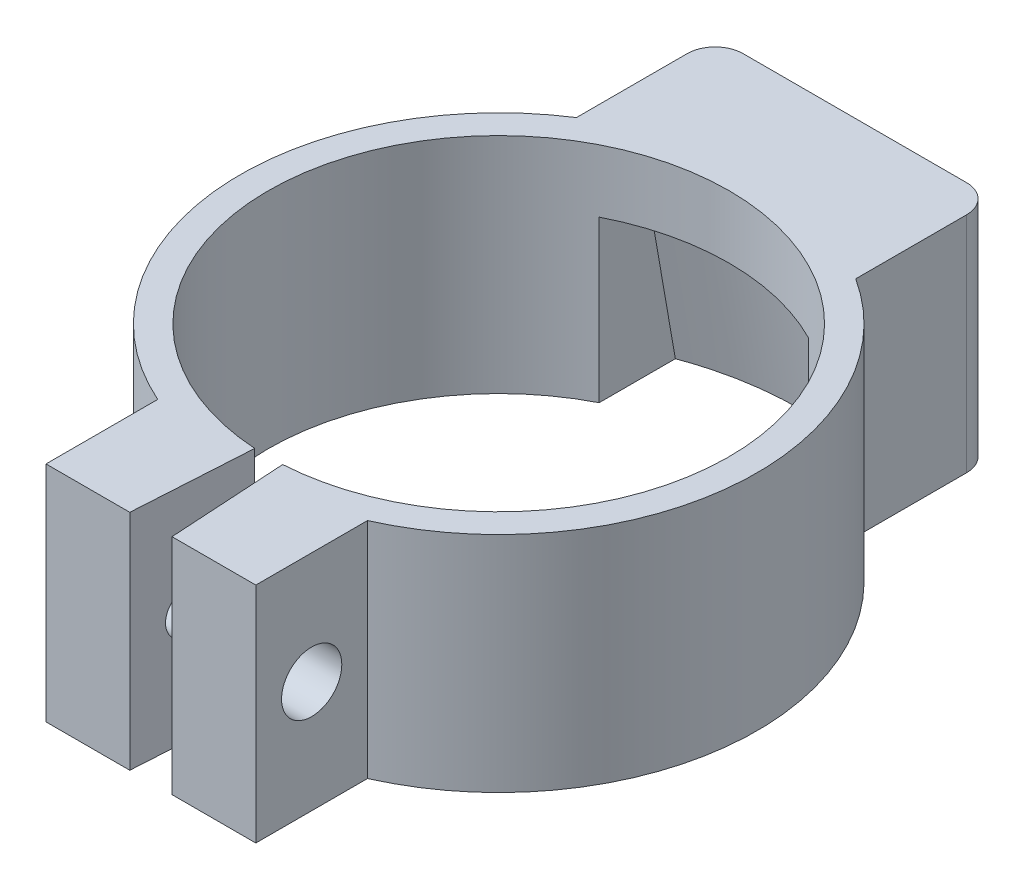
ISO-10303-21;
HEADER;
FILE_DESCRIPTION(('STEP AP214'),'2;1');
FILE_NAME('part.step','',(''),(''),'','','');
FILE_SCHEMA(('AUTOMOTIVE_DESIGN { 1 0 10303 214 1 1 1 1 }'));
ENDSEC;
DATA;
#1=APPLICATION_CONTEXT('core data for automotive mechanical design processes');
#2=APPLICATION_PROTOCOL_DEFINITION('international standard','automotive_design',2000,#1);
#3=PRODUCT_CONTEXT('',#1,'mechanical');
#4=PRODUCT('Part','Part','',(#3));
#5=PRODUCT_RELATED_PRODUCT_CATEGORY('part','',(#4));
#6=PRODUCT_DEFINITION_FORMATION('','',#4);
#7=PRODUCT_DEFINITION_CONTEXT('part definition',#1,'design');
#8=PRODUCT_DEFINITION('design','',#6,#7);
#9=PRODUCT_DEFINITION_SHAPE('','',#8);
#10=(LENGTH_UNIT() NAMED_UNIT(*) SI_UNIT(.MILLI.,.METRE.));
#11=(NAMED_UNIT(*) PLANE_ANGLE_UNIT() SI_UNIT($,.RADIAN.));
#12=(NAMED_UNIT(*) SI_UNIT($,.STERADIAN.) SOLID_ANGLE_UNIT());
#13=UNCERTAINTY_MEASURE_WITH_UNIT(LENGTH_MEASURE(1.E-05),#10,'distance_accuracy_value','');
#14=(GEOMETRIC_REPRESENTATION_CONTEXT(3) GLOBAL_UNCERTAINTY_ASSIGNED_CONTEXT((#13)) GLOBAL_UNIT_ASSIGNED_CONTEXT((#10,
#11,#12)) REPRESENTATION_CONTEXT('',''));
#15=CARTESIAN_POINT('',(0.,0.,0.));
#16=DIRECTION('',(0.,0.,1.));
#17=DIRECTION('',(1.,0.,0.));
#18=AXIS2_PLACEMENT_3D('',#15,#16,#17);
#19=CARTESIAN_POINT('',(0.,16.,0.));
#20=DIRECTION('',(0.,-1.,0.));
#21=DIRECTION('',(0.,0.,-1.));
#22=AXIS2_PLACEMENT_3D('',#19,#20,#21);
#23=CYLINDRICAL_SURFACE('',#22,16.5);
#24=DIRECTION('',(0.,-1.,0.));
#25=VECTOR('',#24,1.);
#26=CARTESIAN_POINT('',(7.5,16.,-14.6969384566991));
#27=LINE('',#26,#25);
#28=CARTESIAN_POINT('',(7.5,0.,-14.6969384566991));
#29=VERTEX_POINT('',#28);
#30=CARTESIAN_POINT('',(7.5,11.5102545806533,-14.6969384566991));
#31=VERTEX_POINT('',#30);
#32=EDGE_CURVE('E167',#29,#31,#27,.F.);
#33=ORIENTED_EDGE('',*,*,#32,.F.);
#34=CARTESIAN_POINT('',(0.,0.,0.));
#35=DIRECTION('',(0.,-1.,0.));
#36=DIRECTION('',(0.,0.,1.));
#37=AXIS2_PLACEMENT_3D('',#34,#35,#36);
#38=CIRCLE('',#37,16.5);
#39=CARTESIAN_POINT('',(1.,0.,16.4696690920006));
#40=VERTEX_POINT('',#39);
#41=EDGE_CURVE('E196',#29,#40,#38,.T.);
#42=ORIENTED_EDGE('',*,*,#41,.T.);
#43=DIRECTION('',(0.,-1.,0.));
#44=VECTOR('',#43,1.);
#45=CARTESIAN_POINT('',(1.,16.,16.4696690920006));
#46=LINE('',#45,#44);
#47=CARTESIAN_POINT('',(1.,16.,16.4696690920006));
#48=VERTEX_POINT('',#47);
#49=EDGE_CURVE('E191',#48,#40,#46,.T.);
#50=ORIENTED_EDGE('',*,*,#49,.F.);
#51=CARTESIAN_POINT('',(0.,16.,0.));
#52=DIRECTION('',(0.,-1.,0.));
#53=DIRECTION('',(0.,0.,1.));
#54=AXIS2_PLACEMENT_3D('',#51,#52,#53);
#55=CIRCLE('',#54,16.5);
#56=CARTESIAN_POINT('',(-0.999999999999988,16.,16.4696690920006));
#57=VERTEX_POINT('',#56);
#58=EDGE_CURVE('E197',#57,#48,#55,.T.);
#59=ORIENTED_EDGE('',*,*,#58,.F.);
#60=DIRECTION('',(0.,-1.,0.));
#61=VECTOR('',#60,1.);
#62=CARTESIAN_POINT('',(-0.999999999999988,16.,16.4696690920006));
#63=LINE('',#62,#61);
#64=CARTESIAN_POINT('',(-0.999999999999988,0.,16.4696690920006));
#65=VERTEX_POINT('',#64);
#66=EDGE_CURVE('E223',#57,#65,#63,.T.);
#67=ORIENTED_EDGE('',*,*,#66,.T.);
#68=CARTESIAN_POINT('',(-7.5,0.,-14.6969384566991));
#69=VERTEX_POINT('',#68);
#70=EDGE_CURVE('E224',#65,#69,#38,.T.);
#71=ORIENTED_EDGE('',*,*,#70,.T.);
#72=DIRECTION('',(0.,-1.,0.));
#73=VECTOR('',#72,1.);
#74=CARTESIAN_POINT('',(-7.5,16.,-14.6969384566991));
#75=LINE('',#74,#73);
#76=CARTESIAN_POINT('',(-7.5,11.5102545806533,-14.6969384566991));
#77=VERTEX_POINT('',#76);
#78=EDGE_CURVE('E192',#77,#69,#75,.T.);
#79=ORIENTED_EDGE('',*,*,#78,.F.);
#80=CARTESIAN_POINT('',(0.,11.5102545806533,0.));
#81=DIRECTION('',(0.,1.,0.));
#82=DIRECTION('',(0.,0.,1.));
#83=AXIS2_PLACEMENT_3D('',#80,#81,#82);
#84=CIRCLE('',#83,16.5);
#85=EDGE_CURVE('E190',#77,#31,#84,.F.);
#86=ORIENTED_EDGE('',*,*,#85,.T.);
#87=EDGE_LOOP('',(#33,#42,#50,#59,#67,#71,#79,#86));
#88=FACE_BOUND('',#87,.T.);
#89=ADVANCED_FACE('F33',(#88),#23,.F.);
#90=CARTESIAN_POINT('',(0.,0.,0.));
#91=DIRECTION('',(0.,1.,0.));
#92=DIRECTION('',(0.,0.,1.));
#93=AXIS2_PLACEMENT_3D('',#90,#91,#92);
#94=PLANE('',#93);
#95=DIRECTION('',(0.,0.,1.));
#96=VECTOR('',#95,1.);
#97=CARTESIAN_POINT('',(-10.,0.,-25.5));
#98=LINE('',#97,#96);
#99=CARTESIAN_POINT('',(-10.,0.,-23.5));
#100=VERTEX_POINT('',#99);
#101=CARTESIAN_POINT('',(-10.,0.,-15.5643824162734));
#102=VERTEX_POINT('',#101);
#103=EDGE_CURVE('E239',#100,#102,#98,.T.);
#104=ORIENTED_EDGE('',*,*,#103,.F.);
#105=CARTESIAN_POINT('',(-8.00000000000002,0.,-23.5));
#106=DIRECTION('',(0.,1.,0.));
#107=DIRECTION('',(0.,0.,1.));
#108=AXIS2_PLACEMENT_3D('',#105,#106,#107);
#109=CIRCLE('',#108,2.);
#110=CARTESIAN_POINT('',(-8.00000000000002,0.,-25.5));
#111=VERTEX_POINT('',#110);
#112=EDGE_CURVE('E282',#100,#111,#109,.F.);
#113=ORIENTED_EDGE('',*,*,#112,.T.);
#114=DIRECTION('',(-1.,0.,0.));
#115=VECTOR('',#114,1.);
#116=CARTESIAN_POINT('',(-10.,0.,-25.5));
#117=LINE('',#116,#115);
#118=CARTESIAN_POINT('',(8.,0.,-25.5));
#119=VERTEX_POINT('',#118);
#120=EDGE_CURVE('E237',#119,#111,#117,.T.);
#121=ORIENTED_EDGE('',*,*,#120,.F.);
#122=CARTESIAN_POINT('',(8.,0.,-23.5));
#123=DIRECTION('',(0.,1.,0.));
#124=DIRECTION('',(0.,0.,1.));
#125=AXIS2_PLACEMENT_3D('',#122,#123,#124);
#126=CIRCLE('',#125,2.);
#127=CARTESIAN_POINT('',(10.,0.,-23.5));
#128=VERTEX_POINT('',#127);
#129=EDGE_CURVE('E280',#119,#128,#126,.F.);
#130=ORIENTED_EDGE('',*,*,#129,.T.);
#131=DIRECTION('',(0.,0.,-1.));
#132=VECTOR('',#131,1.);
#133=CARTESIAN_POINT('',(10.,0.,-25.5));
#134=LINE('',#133,#132);
#135=CARTESIAN_POINT('',(10.,0.,-15.5643824162734));
#136=VERTEX_POINT('',#135);
#137=EDGE_CURVE('E235',#136,#128,#134,.T.);
#138=ORIENTED_EDGE('',*,*,#137,.F.);
#139=CARTESIAN_POINT('',(0.,0.,0.));
#140=DIRECTION('',(0.,1.,0.));
#141=DIRECTION('',(0.,0.,1.));
#142=AXIS2_PLACEMENT_3D('',#139,#140,#141);
#143=CIRCLE('',#142,18.5);
#144=CARTESIAN_POINT('',(7.51224050771347,0.,16.9061007495599));
#145=VERTEX_POINT('',#144);
#146=EDGE_CURVE('E233',#145,#136,#143,.T.);
#147=ORIENTED_EDGE('',*,*,#146,.F.);
#148=DIRECTION('',(0.,0.,-1.));
#149=VECTOR('',#148,1.);
#150=CARTESIAN_POINT('',(7.51224050771347,0.,24.9061007495599));
#151=LINE('',#150,#149);
#152=CARTESIAN_POINT('',(7.51224050771347,0.,24.9061007495599));
#153=VERTEX_POINT('',#152);
#154=EDGE_CURVE('E231',#153,#145,#151,.T.);
#155=ORIENTED_EDGE('',*,*,#154,.F.);
#156=DIRECTION('',(1.,0.,0.));
#157=VECTOR('',#156,1.);
#158=CARTESIAN_POINT('',(1.51224050771347,0.,24.9061007495599));
#159=LINE('',#158,#157);
#160=CARTESIAN_POINT('',(1.51224050771347,0.,24.9061007495599));
#161=VERTEX_POINT('',#160);
#162=EDGE_CURVE('E229',#161,#153,#159,.T.);
#163=ORIENTED_EDGE('',*,*,#162,.F.);
#164=DIRECTION('',(0.0606060606060607,0.,0.998161763151552));
#165=VECTOR('',#164,1.);
#166=CARTESIAN_POINT('',(1.,0.,16.4696690920006));
#167=LINE('',#166,#165);
#168=EDGE_CURVE('E227',#40,#161,#167,.T.);
#169=ORIENTED_EDGE('',*,*,#168,.F.);
#170=ORIENTED_EDGE('',*,*,#41,.F.);
#171=DIRECTION('',(0.,0.,-1.));
#172=VECTOR('',#171,1.);
#173=CARTESIAN_POINT('',(7.5,0.,-18.1494416796099));
#174=LINE('',#173,#172);
#175=CARTESIAN_POINT('',(7.5,0.,-20.1494416796099));
#176=VERTEX_POINT('',#175);
#177=EDGE_CURVE('E188',#29,#176,#174,.T.);
#178=ORIENTED_EDGE('',*,*,#177,.T.);
#179=CARTESIAN_POINT('',(7.5,0.,-20.1494416796099));
#180=CARTESIAN_POINT('',(7.16475403210479,0.,-20.2742349802381));
#181=CARTESIAN_POINT('',(6.82638911447382,0.,-20.390646524342));
#182=CARTESIAN_POINT('',(6.14429831053419,0.,-20.6064420032133));
#183=CARTESIAN_POINT('',(5.80057280054934,0.,-20.7058271274494));
#184=CARTESIAN_POINT('',(5.10860092589791,0.,-20.8873204885351));
#185=CARTESIAN_POINT('',(4.76035469587702,0.,-20.9694292386987));
#186=CARTESIAN_POINT('',(4.05949924995959,0.,-21.1163186682423));
#187=CARTESIAN_POINT('',(3.70688268749984,0.,-21.18106428229));
#188=CARTESIAN_POINT('',(2.99884233367474,0.,-21.2928483222732));
#189=CARTESIAN_POINT('',(2.64341849642989,0.,-21.3398864582002));
#190=CARTESIAN_POINT('',(1.93067071288312,0.,-21.4161389406646));
#191=CARTESIAN_POINT('',(1.57334668941058,0.,-21.4453525576471));
#192=CARTESIAN_POINT('',(0.611433592468125,0.,-21.4998149719763));
#193=CARTESIAN_POINT('',(0.00583316623607212,0.,-21.5085133370044));
#194=CARTESIAN_POINT('',(-1.20404534343382,0.,-21.4747890906468));
#195=CARTESIAN_POINT('',(-1.80832321021341,0.,-21.4323586520107));
#196=CARTESIAN_POINT('',(-2.70973722956552,0.,-21.3306962680113));
#197=CARTESIAN_POINT('',(-3.00912394907806,0.,-21.290522630107));
#198=CARTESIAN_POINT('',(-3.60585369761852,0.,-21.1976177237416));
#199=CARTESIAN_POINT('',(-3.90319723427066,0.,-21.1448896996906));
#200=CARTESIAN_POINT('',(-4.79125375433414,0.,-20.9680205933349));
#201=CARTESIAN_POINT('',(-5.37839675731777,0.,-20.8251488548804));
#202=CARTESIAN_POINT('',(-6.21849099831456,0.,-20.5828527744341));
#203=CARTESIAN_POINT('',(-6.47723965517101,0.,-20.5028959028532));
#204=CARTESIAN_POINT('',(-6.9912359309097,0.,-20.3333645235655));
#205=CARTESIAN_POINT('',(-7.2464872441091,0.,-20.2438012166994));
#206=CARTESIAN_POINT('',(-7.5,0.,-20.1494416796099));
#207=B_SPLINE_CURVE_WITH_KNOTS('',3,(#179,#180,#181,#182,#183,#184,#185,#186,#187,#188,#189,
#190,#191,#192,#193,#194,#195,#196,#197,#198,#199,#200,#201,#202,#203,#204,#205,#206),
.UNSPECIFIED.,.F.,.F.,(4,2,2,2,2,2,2,2,2,2,2,2,2,4),(0.,1.07304557880704,2.14601616386372,
3.21895486441766,4.29404434958836,5.36915144153298,6.44430253450244,8.25902479211883,
10.0740248988004,10.9799954654977,11.8857321573009,13.695989208273,14.5083027837762,
15.319679313318),.UNSPECIFIED.);
#208=CARTESIAN_POINT('',(-7.5,0.,-20.1494416796099));
#209=VERTEX_POINT('',#208);
#210=EDGE_CURVE('E182',#176,#209,#207,.T.);
#211=ORIENTED_EDGE('',*,*,#210,.T.);
#212=DIRECTION('',(0.,0.,1.));
#213=VECTOR('',#212,1.);
#214=CARTESIAN_POINT('',(-7.5,0.,-18.1494416796099));
#215=LINE('',#214,#213);
#216=EDGE_CURVE('E194',#209,#69,#215,.T.);
#217=ORIENTED_EDGE('',*,*,#216,.T.);
#218=ORIENTED_EDGE('',*,*,#70,.F.);
#219=DIRECTION('',(0.0606060606060612,0.,-0.998161763151552));
#220=VECTOR('',#219,1.);
#221=CARTESIAN_POINT('',(-0.999999999999988,0.,16.4696690920006));
#222=LINE('',#221,#220);
#223=CARTESIAN_POINT('',(-1.51224050771347,0.,24.9061007495599));
#224=VERTEX_POINT('',#223);
#225=EDGE_CURVE('E201',#224,#65,#222,.T.);
#226=ORIENTED_EDGE('',*,*,#225,.F.);
#227=DIRECTION('',(1.,0.,0.));
#228=VECTOR('',#227,1.);
#229=CARTESIAN_POINT('',(-1.51224050771347,0.,24.9061007495599));
#230=LINE('',#229,#228);
#231=CARTESIAN_POINT('',(-7.51224050771347,0.,24.9061007495599));
#232=VERTEX_POINT('',#231);
#233=EDGE_CURVE('E245',#232,#224,#230,.T.);
#234=ORIENTED_EDGE('',*,*,#233,.F.);
#235=DIRECTION('',(0.,0.,1.));
#236=VECTOR('',#235,1.);
#237=CARTESIAN_POINT('',(-7.51224050771347,0.,24.9061007495599));
#238=LINE('',#237,#236);
#239=CARTESIAN_POINT('',(-7.51224050771348,0.,16.9061007495599));
#240=VERTEX_POINT('',#239);
#241=EDGE_CURVE('E243',#240,#232,#238,.T.);
#242=ORIENTED_EDGE('',*,*,#241,.F.);
#243=CARTESIAN_POINT('',(0.,0.,0.));
#244=DIRECTION('',(0.,1.,0.));
#245=DIRECTION('',(0.,0.,1.));
#246=AXIS2_PLACEMENT_3D('',#243,#244,#245);
#247=CIRCLE('',#246,18.5);
#248=EDGE_CURVE('E241',#102,#240,#247,.T.);
#249=ORIENTED_EDGE('',*,*,#248,.F.);
#250=EDGE_LOOP('',(#104,#113,#121,#130,#138,#147,#155,#163,#169,#170,#178,#211,#217,#218,#226,
#234,#242,#249));
#251=FACE_BOUND('',#250,.T.);
#252=ADVANCED_FACE('F303',(#251),#94,.F.);
#253=CARTESIAN_POINT('',(1.,16.,16.4696690920006));
#254=DIRECTION('',(0.998161763151552,0.,-0.0606060606060607));
#255=DIRECTION('',(-0.0606060606060607,0.,-0.998161763151552));
#256=AXIS2_PLACEMENT_3D('',#253,#254,#255);
#257=PLANE('',#256);
#258=CARTESIAN_POINT('',(1.2693698114259,8.,20.9061007495599));
#259=DIRECTION('',(0.998161763151552,0.,-0.0606060606060607));
#260=DIRECTION('',(0.0606060606060607,0.,0.998161763151552));
#261=AXIS2_PLACEMENT_3D('',#258,#259,#260);
#262=ELLIPSE('',#261,2.16297606230003,2.159);
#263=CARTESIAN_POINT('',(1.40045926974712,8.,23.0651007495599));
#264=VERTEX_POINT('',#263);
#265=EDGE_CURVE('E558',#264,#264,#262,.F.);
#266=ORIENTED_EDGE('',*,*,#265,.F.);
#267=EDGE_LOOP('',(#266));
#268=FACE_BOUND('',#267,.T.);
#269=ORIENTED_EDGE('',*,*,#168,.T.);
#270=DIRECTION('',(0.,-1.,0.));
#271=VECTOR('',#270,1.);
#272=CARTESIAN_POINT('',(1.51224050771347,16.,24.9061007495599));
#273=LINE('',#272,#271);
#274=CARTESIAN_POINT('',(1.51224050771347,16.,24.9061007495599));
#275=VERTEX_POINT('',#274);
#276=EDGE_CURVE('E271',#275,#161,#273,.T.);
#277=ORIENTED_EDGE('',*,*,#276,.F.);
#278=DIRECTION('',(0.0606060606060607,0.,0.998161763151552));
#279=VECTOR('',#278,1.);
#280=CARTESIAN_POINT('',(1.,16.,16.4696690920006));
#281=LINE('',#280,#279);
#282=EDGE_CURVE('E200',#48,#275,#281,.T.);
#283=ORIENTED_EDGE('',*,*,#282,.F.);
#284=ORIENTED_EDGE('',*,*,#49,.T.);
#285=EDGE_LOOP('',(#269,#277,#283,#284));
#286=FACE_BOUND('',#285,.T.);
#287=ADVANCED_FACE('F329',(#268,#286),#257,.F.);
#288=CARTESIAN_POINT('',(1.51224050771347,16.,24.9061007495599));
#289=DIRECTION('',(0.,0.,-1.));
#290=DIRECTION('',(-1.,0.,0.));
#291=AXIS2_PLACEMENT_3D('',#288,#289,#290);
#292=PLANE('',#291);
#293=ORIENTED_EDGE('',*,*,#162,.T.);
#294=DIRECTION('',(0.,-1.,0.));
#295=VECTOR('',#294,1.);
#296=CARTESIAN_POINT('',(7.51224050771347,16.,24.9061007495599));
#297=LINE('',#296,#295);
#298=CARTESIAN_POINT('',(7.51224050771347,16.,24.9061007495599));
#299=VERTEX_POINT('',#298);
#300=EDGE_CURVE('E268',#299,#153,#297,.T.);
#301=ORIENTED_EDGE('',*,*,#300,.F.);
#302=DIRECTION('',(1.,0.,0.));
#303=VECTOR('',#302,1.);
#304=CARTESIAN_POINT('',(1.51224050771347,16.,24.9061007495599));
#305=LINE('',#304,#303);
#306=EDGE_CURVE('E203',#275,#299,#305,.T.);
#307=ORIENTED_EDGE('',*,*,#306,.F.);
#308=ORIENTED_EDGE('',*,*,#276,.T.);
#309=EDGE_LOOP('',(#293,#301,#307,#308));
#310=FACE_BOUND('',#309,.T.);
#311=ADVANCED_FACE('F326',(#310),#292,.F.);
#312=CARTESIAN_POINT('',(7.51224050771347,16.,24.9061007495599));
#313=DIRECTION('',(-1.,0.,0.));
#314=DIRECTION('',(0.,0.,1.));
#315=AXIS2_PLACEMENT_3D('',#312,#313,#314);
#316=PLANE('',#315);
#317=CARTESIAN_POINT('',(7.51224050771347,8.,20.9061007495599));
#318=DIRECTION('',(1.,0.,0.));
#319=DIRECTION('',(0.,0.,-1.));
#320=AXIS2_PLACEMENT_3D('',#317,#318,#319);
#321=CIRCLE('',#320,2.159);
#322=CARTESIAN_POINT('',(7.51224050771347,8.,18.7471007495599));
#323=VERTEX_POINT('',#322);
#324=EDGE_CURVE('E562',#323,#323,#321,.T.);
#325=ORIENTED_EDGE('',*,*,#324,.F.);
#326=EDGE_LOOP('',(#325));
#327=FACE_BOUND('',#326,.T.);
#328=ORIENTED_EDGE('',*,*,#154,.T.);
#329=DIRECTION('',(0.,-1.,0.));
#330=VECTOR('',#329,1.);
#331=CARTESIAN_POINT('',(7.51224050771347,16.,16.9061007495599));
#332=LINE('',#331,#330);
#333=CARTESIAN_POINT('',(7.51224050771347,16.,16.9061007495599));
#334=VERTEX_POINT('',#333);
#335=EDGE_CURVE('E265',#334,#145,#332,.T.);
#336=ORIENTED_EDGE('',*,*,#335,.F.);
#337=DIRECTION('',(0.,0.,-1.));
#338=VECTOR('',#337,1.);
#339=CARTESIAN_POINT('',(7.51224050771347,16.,24.9061007495599));
#340=LINE('',#339,#338);
#341=EDGE_CURVE('E205',#299,#334,#340,.T.);
#342=ORIENTED_EDGE('',*,*,#341,.F.);
#343=ORIENTED_EDGE('',*,*,#300,.T.);
#344=EDGE_LOOP('',(#328,#336,#342,#343));
#345=FACE_BOUND('',#344,.T.);
#346=ADVANCED_FACE('F321',(#327,#345),#316,.F.);
#347=CARTESIAN_POINT('',(0.,16.,0.));
#348=DIRECTION('',(0.,-1.,0.));
#349=DIRECTION('',(0.,0.,-1.));
#350=AXIS2_PLACEMENT_3D('',#347,#348,#349);
#351=CYLINDRICAL_SURFACE('',#350,18.5);
#352=ORIENTED_EDGE('',*,*,#146,.T.);
#353=DIRECTION('',(0.,-1.,0.));
#354=VECTOR('',#353,1.);
#355=CARTESIAN_POINT('',(10.,16.,-15.5643824162734));
#356=LINE('',#355,#354);
#357=CARTESIAN_POINT('',(10.,16.,-15.5643824162734));
#358=VERTEX_POINT('',#357);
#359=EDGE_CURVE('E262',#358,#136,#356,.T.);
#360=ORIENTED_EDGE('',*,*,#359,.F.);
#361=CARTESIAN_POINT('',(0.,16.,0.));
#362=DIRECTION('',(0.,1.,0.));
#363=DIRECTION('',(0.,0.,1.));
#364=AXIS2_PLACEMENT_3D('',#361,#362,#363);
#365=CIRCLE('',#364,18.5);
#366=EDGE_CURVE('E207',#334,#358,#365,.T.);
#367=ORIENTED_EDGE('',*,*,#366,.F.);
#368=ORIENTED_EDGE('',*,*,#335,.T.);
#369=EDGE_LOOP('',(#352,#360,#367,#368));
#370=FACE_BOUND('',#369,.T.);
#371=ADVANCED_FACE('F315',(#370),#351,.T.);
#372=CARTESIAN_POINT('',(10.,16.,-25.5));
#373=DIRECTION('',(-1.,0.,0.));
#374=DIRECTION('',(0.,0.,1.));
#375=AXIS2_PLACEMENT_3D('',#372,#373,#374);
#376=PLANE('',#375);
#377=ORIENTED_EDGE('',*,*,#137,.T.);
#378=DIRECTION('',(0.,-1.,0.));
#379=VECTOR('',#378,1.);
#380=CARTESIAN_POINT('',(10.,16.,-23.5));
#381=LINE('',#380,#379);
#382=CARTESIAN_POINT('',(10.,16.,-23.5));
#383=VERTEX_POINT('',#382);
#384=EDGE_CURVE('E11',#128,#383,#381,.F.);
#385=ORIENTED_EDGE('',*,*,#384,.T.);
#386=DIRECTION('',(0.,0.,-1.));
#387=VECTOR('',#386,1.);
#388=CARTESIAN_POINT('',(10.,16.,-25.5));
#389=LINE('',#388,#387);
#390=EDGE_CURVE('E209',#358,#383,#389,.T.);
#391=ORIENTED_EDGE('',*,*,#390,.F.);
#392=ORIENTED_EDGE('',*,*,#359,.T.);
#393=EDGE_LOOP('',(#377,#385,#391,#392));
#394=FACE_BOUND('',#393,.T.);
#395=ADVANCED_FACE('F311',(#394),#376,.F.);
#396=CARTESIAN_POINT('',(-10.,16.,-25.5));
#397=DIRECTION('',(0.,0.,1.));
#398=DIRECTION('',(1.,0.,0.));
#399=AXIS2_PLACEMENT_3D('',#396,#397,#398);
#400=PLANE('',#399);
#401=ORIENTED_EDGE('',*,*,#120,.T.);
#402=DIRECTION('',(0.,-1.,0.));
#403=VECTOR('',#402,1.);
#404=CARTESIAN_POINT('',(-8.00000000000002,16.,-25.5));
#405=LINE('',#404,#403);
#406=CARTESIAN_POINT('',(-8.00000000000002,16.,-25.5));
#407=VERTEX_POINT('',#406);
#408=EDGE_CURVE('E54',#111,#407,#405,.F.);
#409=ORIENTED_EDGE('',*,*,#408,.T.);
#410=DIRECTION('',(-1.,0.,0.));
#411=VECTOR('',#410,1.);
#412=CARTESIAN_POINT('',(-10.,16.,-25.5));
#413=LINE('',#412,#411);
#414=CARTESIAN_POINT('',(8.,16.,-25.5));
#415=VERTEX_POINT('',#414);
#416=EDGE_CURVE('E211',#415,#407,#413,.T.);
#417=ORIENTED_EDGE('',*,*,#416,.F.);
#418=DIRECTION('',(0.,-1.,0.));
#419=VECTOR('',#418,1.);
#420=CARTESIAN_POINT('',(8.,16.,-25.5));
#421=LINE('',#420,#419);
#422=EDGE_CURVE('E284',#415,#119,#421,.T.);
#423=ORIENTED_EDGE('',*,*,#422,.T.);
#424=EDGE_LOOP('',(#401,#409,#417,#423));
#425=FACE_BOUND('',#424,.T.);
#426=ADVANCED_FACE('F305',(#425),#400,.F.);
#427=CARTESIAN_POINT('',(-10.,16.,-25.5));
#428=DIRECTION('',(1.,0.,0.));
#429=DIRECTION('',(0.,0.,-1.));
#430=AXIS2_PLACEMENT_3D('',#427,#428,#429);
#431=PLANE('',#430);
#432=DIRECTION('',(0.,0.,1.));
#433=VECTOR('',#432,1.);
#434=CARTESIAN_POINT('',(-10.,16.,-25.5));
#435=LINE('',#434,#433);
#436=CARTESIAN_POINT('',(-10.,16.,-23.5));
#437=VERTEX_POINT('',#436);
#438=CARTESIAN_POINT('',(-10.,16.,-15.5643824162734));
#439=VERTEX_POINT('',#438);
#440=EDGE_CURVE('E213',#437,#439,#435,.T.);
#441=ORIENTED_EDGE('',*,*,#440,.F.);
#442=DIRECTION('',(0.,-1.,0.));
#443=VECTOR('',#442,1.);
#444=CARTESIAN_POINT('',(-10.,16.,-23.5));
#445=LINE('',#444,#443);
#446=EDGE_CURVE('E277',#437,#100,#445,.T.);
#447=ORIENTED_EDGE('',*,*,#446,.T.);
#448=ORIENTED_EDGE('',*,*,#103,.T.);
#449=DIRECTION('',(0.,-1.,0.));
#450=VECTOR('',#449,1.);
#451=CARTESIAN_POINT('',(-10.,16.,-15.5643824162734));
#452=LINE('',#451,#450);
#453=EDGE_CURVE('E259',#439,#102,#452,.T.);
#454=ORIENTED_EDGE('',*,*,#453,.F.);
#455=EDGE_LOOP('',(#441,#447,#448,#454));
#456=FACE_BOUND('',#455,.T.);
#457=ADVANCED_FACE('F297',(#456),#431,.F.);
#458=CARTESIAN_POINT('',(0.,16.,0.));
#459=DIRECTION('',(0.,-1.,0.));
#460=DIRECTION('',(0.,0.,-1.));
#461=AXIS2_PLACEMENT_3D('',#458,#459,#460);
#462=CYLINDRICAL_SURFACE('',#461,18.5);
#463=ORIENTED_EDGE('',*,*,#248,.T.);
#464=DIRECTION('',(0.,-1.,0.));
#465=VECTOR('',#464,1.);
#466=CARTESIAN_POINT('',(-7.51224050771348,16.,16.9061007495599));
#467=LINE('',#466,#465);
#468=CARTESIAN_POINT('',(-7.51224050771348,16.,16.9061007495599));
#469=VERTEX_POINT('',#468);
#470=EDGE_CURVE('E256',#469,#240,#467,.T.);
#471=ORIENTED_EDGE('',*,*,#470,.F.);
#472=CARTESIAN_POINT('',(0.,16.,0.));
#473=DIRECTION('',(0.,1.,0.));
#474=DIRECTION('',(0.,0.,1.));
#475=AXIS2_PLACEMENT_3D('',#472,#473,#474);
#476=CIRCLE('',#475,18.5);
#477=EDGE_CURVE('E215',#439,#469,#476,.T.);
#478=ORIENTED_EDGE('',*,*,#477,.F.);
#479=ORIENTED_EDGE('',*,*,#453,.T.);
#480=EDGE_LOOP('',(#463,#471,#478,#479));
#481=FACE_BOUND('',#480,.T.);
#482=ADVANCED_FACE('F390',(#481),#462,.T.);
#483=CARTESIAN_POINT('',(-7.51224050771347,16.,24.9061007495599));
#484=DIRECTION('',(1.,0.,0.));
#485=DIRECTION('',(0.,0.,-1.));
#486=AXIS2_PLACEMENT_3D('',#483,#484,#485);
#487=PLANE('',#486);
#488=CARTESIAN_POINT('',(-7.51224050771347,8.,20.9061007495599));
#489=DIRECTION('',(-1.,0.,0.));
#490=DIRECTION('',(0.,0.,1.));
#491=AXIS2_PLACEMENT_3D('',#488,#489,#490);
#492=CIRCLE('',#491,1.5875);
#493=CARTESIAN_POINT('',(-7.51224050771347,8.,22.4936007495599));
#494=VERTEX_POINT('',#493);
#495=EDGE_CURVE('E178',#494,#494,#492,.T.);
#496=ORIENTED_EDGE('',*,*,#495,.F.);
#497=EDGE_LOOP('',(#496));
#498=FACE_BOUND('',#497,.T.);
#499=ORIENTED_EDGE('',*,*,#241,.T.);
#500=DIRECTION('',(0.,-1.,0.));
#501=VECTOR('',#500,1.);
#502=CARTESIAN_POINT('',(-7.51224050771347,16.,24.9061007495599));
#503=LINE('',#502,#501);
#504=CARTESIAN_POINT('',(-7.51224050771347,16.,24.9061007495599));
#505=VERTEX_POINT('',#504);
#506=EDGE_CURVE('E253',#505,#232,#503,.T.);
#507=ORIENTED_EDGE('',*,*,#506,.F.);
#508=DIRECTION('',(0.,0.,1.));
#509=VECTOR('',#508,1.);
#510=CARTESIAN_POINT('',(-7.51224050771347,16.,24.9061007495599));
#511=LINE('',#510,#509);
#512=EDGE_CURVE('E217',#469,#505,#511,.T.);
#513=ORIENTED_EDGE('',*,*,#512,.F.);
#514=ORIENTED_EDGE('',*,*,#470,.T.);
#515=EDGE_LOOP('',(#499,#507,#513,#514));
#516=FACE_BOUND('',#515,.T.);
#517=ADVANCED_FACE('F393',(#498,#516),#487,.F.);
#518=CARTESIAN_POINT('',(-1.51224050771347,16.,24.9061007495599));
#519=DIRECTION('',(0.,0.,-1.));
#520=DIRECTION('',(-1.,0.,0.));
#521=AXIS2_PLACEMENT_3D('',#518,#519,#520);
#522=PLANE('',#521);
#523=ORIENTED_EDGE('',*,*,#233,.T.);
#524=DIRECTION('',(0.,-1.,0.));
#525=VECTOR('',#524,1.);
#526=CARTESIAN_POINT('',(-1.51224050771347,16.,24.9061007495599));
#527=LINE('',#526,#525);
#528=CARTESIAN_POINT('',(-1.51224050771347,16.,24.9061007495599));
#529=VERTEX_POINT('',#528);
#530=EDGE_CURVE('E250',#529,#224,#527,.T.);
#531=ORIENTED_EDGE('',*,*,#530,.F.);
#532=DIRECTION('',(1.,0.,0.));
#533=VECTOR('',#532,1.);
#534=CARTESIAN_POINT('',(-1.51224050771347,16.,24.9061007495599));
#535=LINE('',#534,#533);
#536=EDGE_CURVE('E219',#505,#529,#535,.T.);
#537=ORIENTED_EDGE('',*,*,#536,.F.);
#538=ORIENTED_EDGE('',*,*,#506,.T.);
#539=EDGE_LOOP('',(#523,#531,#537,#538));
#540=FACE_BOUND('',#539,.T.);
#541=ADVANCED_FACE('F397',(#540),#522,.F.);
#542=CARTESIAN_POINT('',(-0.999999999999988,16.,16.4696690920006));
#543=DIRECTION('',(-0.998161763151552,0.,-0.0606060606060612));
#544=DIRECTION('',(-0.0606060606060612,0.,0.998161763151552));
#545=AXIS2_PLACEMENT_3D('',#542,#543,#544);
#546=PLANE('',#545);
#547=CARTESIAN_POINT('',(-1.26936981142589,8.,20.9061007495599));
#548=DIRECTION('',(-0.998161763151552,0.,-0.0606060606060612));
#549=DIRECTION('',(-0.0606060606060612,0.,0.998161763151552));
#550=AXIS2_PLACEMENT_3D('',#547,#548,#549);
#551=ELLIPSE('',#550,1.59042357522061,1.5875);
#552=CARTESIAN_POINT('',(-1.36575911901502,8.,22.4936007495599));
#553=VERTEX_POINT('',#552);
#554=EDGE_CURVE('E545',#553,#553,#551,.F.);
#555=ORIENTED_EDGE('',*,*,#554,.F.);
#556=EDGE_LOOP('',(#555));
#557=FACE_BOUND('',#556,.T.);
#558=ORIENTED_EDGE('',*,*,#225,.T.);
#559=ORIENTED_EDGE('',*,*,#66,.F.);
#560=DIRECTION('',(0.0606060606060612,0.,-0.998161763151552));
#561=VECTOR('',#560,1.);
#562=CARTESIAN_POINT('',(-0.999999999999988,16.,16.4696690920006));
#563=LINE('',#562,#561);
#564=EDGE_CURVE('E221',#529,#57,#563,.T.);
#565=ORIENTED_EDGE('',*,*,#564,.F.);
#566=ORIENTED_EDGE('',*,*,#530,.T.);
#567=EDGE_LOOP('',(#558,#559,#565,#566));
#568=FACE_BOUND('',#567,.T.);
#569=ADVANCED_FACE('F401',(#557,#568),#546,.F.);
#570=CARTESIAN_POINT('',(0.,16.,0.));
#571=DIRECTION('',(0.,1.,0.));
#572=DIRECTION('',(0.,0.,1.));
#573=AXIS2_PLACEMENT_3D('',#570,#571,#572);
#574=PLANE('',#573);
#575=ORIENTED_EDGE('',*,*,#416,.T.);
#576=CARTESIAN_POINT('',(-8.00000000000002,16.,-23.5));
#577=DIRECTION('',(0.,1.,0.));
#578=DIRECTION('',(0.,0.,1.));
#579=AXIS2_PLACEMENT_3D('',#576,#577,#578);
#580=CIRCLE('',#579,2.);
#581=EDGE_CURVE('E41',#407,#437,#580,.T.);
#582=ORIENTED_EDGE('',*,*,#581,.T.);
#583=ORIENTED_EDGE('',*,*,#440,.T.);
#584=ORIENTED_EDGE('',*,*,#477,.T.);
#585=ORIENTED_EDGE('',*,*,#512,.T.);
#586=ORIENTED_EDGE('',*,*,#536,.T.);
#587=ORIENTED_EDGE('',*,*,#564,.T.);
#588=ORIENTED_EDGE('',*,*,#58,.T.);
#589=ORIENTED_EDGE('',*,*,#282,.T.);
#590=ORIENTED_EDGE('',*,*,#306,.T.);
#591=ORIENTED_EDGE('',*,*,#341,.T.);
#592=ORIENTED_EDGE('',*,*,#366,.T.);
#593=ORIENTED_EDGE('',*,*,#390,.T.);
#594=CARTESIAN_POINT('',(8.,16.,-23.5));
#595=DIRECTION('',(0.,1.,0.));
#596=DIRECTION('',(0.,0.,1.));
#597=AXIS2_PLACEMENT_3D('',#594,#595,#596);
#598=CIRCLE('',#597,2.);
#599=EDGE_CURVE('E288',#383,#415,#598,.T.);
#600=ORIENTED_EDGE('',*,*,#599,.T.);
#601=EDGE_LOOP('',(#575,#582,#583,#584,#585,#586,#587,#588,#589,#590,#591,#592,#593,#600));
#602=FACE_BOUND('',#601,.T.);
#603=ADVANCED_FACE('F292',(#602),#574,.T.);
#604=CARTESIAN_POINT('',(0.,11.5102545806533,2.00000000000001));
#605=DIRECTION('',(0.,1.,0.));
#606=DIRECTION('',(0.,0.,1.));
#607=AXIS2_PLACEMENT_3D('',#604,#605,#606);
#608=PLANE('',#607);
#609=DIRECTION('',(0.,0.,1.));
#610=VECTOR('',#609,1.);
#611=CARTESIAN_POINT('',(-7.5,11.5102545806533,-18.1494416796099));
#612=LINE('',#611,#610);
#613=CARTESIAN_POINT('',(-7.5,11.5102545806533,-18.1494416796099));
#614=VERTEX_POINT('',#613);
#615=EDGE_CURVE('E170',#614,#77,#612,.T.);
#616=ORIENTED_EDGE('',*,*,#615,.F.);
#617=CARTESIAN_POINT('',(0.,11.5102545806533,2.00000000000001));
#618=DIRECTION('',(0.,1.,0.));
#619=DIRECTION('',(0.,0.,1.));
#620=AXIS2_PLACEMENT_3D('',#617,#618,#619);
#621=CIRCLE('',#620,21.5);
#622=CARTESIAN_POINT('',(7.5,11.5102545806533,-18.1494416796099));
#623=VERTEX_POINT('',#622);
#624=EDGE_CURVE('E173',#623,#614,#621,.T.);
#625=ORIENTED_EDGE('',*,*,#624,.F.);
#626=DIRECTION('',(0.,0.,-1.));
#627=VECTOR('',#626,1.);
#628=CARTESIAN_POINT('',(7.5,11.5102545806533,-18.1494416796099));
#629=LINE('',#628,#627);
#630=EDGE_CURVE('E160',#31,#623,#629,.T.);
#631=ORIENTED_EDGE('',*,*,#630,.F.);
#632=ORIENTED_EDGE('',*,*,#85,.F.);
#633=EDGE_LOOP('',(#616,#625,#631,#632));
#634=FACE_BOUND('',#633,.T.);
#635=ADVANCED_FACE('F174',(#634),#608,.F.);
#636=CARTESIAN_POINT('',(7.5,11.5102545806533,-18.1494416796099));
#637=DIRECTION('',(-1.,0.,0.));
#638=DIRECTION('',(0.,0.,1.));
#639=AXIS2_PLACEMENT_3D('',#636,#637,#638);
#640=PLANE('',#639);
#641=ORIENTED_EDGE('',*,*,#32,.T.);
#642=ORIENTED_EDGE('',*,*,#630,.T.);
#643=DIRECTION('',(0.,-0.985237512667381,-0.171193001121521));
#644=VECTOR('',#643,1.);
#645=CARTESIAN_POINT('',(7.5,11.5102545806533,-18.1494416796099));
#646=LINE('',#645,#644);
#647=EDGE_CURVE('E164',#623,#176,#646,.T.);
#648=ORIENTED_EDGE('',*,*,#647,.T.);
#649=ORIENTED_EDGE('',*,*,#177,.F.);
#650=EDGE_LOOP('',(#641,#642,#648,#649));
#651=FACE_BOUND('',#650,.T.);
#652=ADVANCED_FACE('F162',(#651),#640,.T.);
#653=CARTESIAN_POINT('',(-7.5,11.5102545806533,-18.1494416796099));
#654=DIRECTION('',(1.,0.,0.));
#655=DIRECTION('',(0.,0.,-1.));
#656=AXIS2_PLACEMENT_3D('',#653,#654,#655);
#657=PLANE('',#656);
#658=ORIENTED_EDGE('',*,*,#78,.T.);
#659=ORIENTED_EDGE('',*,*,#216,.F.);
#660=DIRECTION('',(0.,-0.985237512667381,-0.171193001121521));
#661=VECTOR('',#660,1.);
#662=CARTESIAN_POINT('',(-7.5,11.5102545806533,-18.1494416796099));
#663=LINE('',#662,#661);
#664=EDGE_CURVE('E183',#614,#209,#663,.T.);
#665=ORIENTED_EDGE('',*,*,#664,.F.);
#666=ORIENTED_EDGE('',*,*,#615,.T.);
#667=EDGE_LOOP('',(#658,#659,#665,#666));
#668=FACE_BOUND('',#667,.T.);
#669=ADVANCED_FACE('F336',(#668),#657,.T.);
#670=CARTESIAN_POINT('',(7.5,11.5102545806533,-18.1494416796099));
#671=CARTESIAN_POINT('',(7.5,-1.00005809400305,-20.3232098768284));
#672=CARTESIAN_POINT('',(2.60927044688977,11.5102545806533,-19.969862921626));
#673=CARTESIAN_POINT('',(2.60927044688977,-1.00005809400305,-22.1436311188445));
#674=CARTESIAN_POINT('',(-2.60927044688976,11.5102545806533,-19.969862921626));
#675=CARTESIAN_POINT('',(-2.60927044688976,-1.00005809400305,-22.1436311188445));
#676=CARTESIAN_POINT('',(-7.5,11.5102545806533,-18.1494416796099));
#677=CARTESIAN_POINT('',(-7.5,-1.00005809400305,-20.3232098768284));
#678=(BOUNDED_SURFACE() B_SPLINE_SURFACE(3,1,((#670,#671),(#672,#673),(#674,#675),(#676,#677)),
.UNSPECIFIED.,.F.,.F.,.F.) B_SPLINE_SURFACE_WITH_KNOTS((4,4),(2,2),(0.,1.),(0.,1.),
.UNSPECIFIED.) GEOMETRIC_REPRESENTATION_ITEM() RATIONAL_B_SPLINE_SURFACE(((1.,1.),
(0.958122222623562,0.958122222623562),(0.958122222623562,0.958122222623562),(1.,1.))) REPRESENTATION_ITEM('') SURFACE());
#679=ORIENTED_EDGE('',*,*,#647,.F.);
#680=ORIENTED_EDGE('',*,*,#624,.T.);
#681=ORIENTED_EDGE('',*,*,#664,.T.);
#682=ORIENTED_EDGE('',*,*,#210,.F.);
#683=EDGE_LOOP('',(#679,#680,#681,#682));
#684=FACE_BOUND('',#683,.T.);
#685=ADVANCED_FACE('F180',(#684),#678,.T.);
#686=CARTESIAN_POINT('',(18.501,8.,20.9061007495599));
#687=DIRECTION('',(-1.,0.,0.));
#688=DIRECTION('',(0.,0.,1.));
#689=AXIS2_PLACEMENT_3D('',#686,#687,#688);
#690=CYLINDRICAL_SURFACE('',#689,1.5875);
#691=ORIENTED_EDGE('',*,*,#495,.T.);
#692=EDGE_LOOP('',(#691));
#693=FACE_BOUND('',#692,.T.);
#694=ORIENTED_EDGE('',*,*,#554,.T.);
#695=EDGE_LOOP('',(#694));
#696=FACE_BOUND('',#695,.T.);
#697=ADVANCED_FACE('F355',(#693,#696),#690,.F.);
#698=CARTESIAN_POINT('',(-18.501,8.,20.9061007495599));
#699=DIRECTION('',(1.,0.,0.));
#700=DIRECTION('',(0.,0.,-1.));
#701=AXIS2_PLACEMENT_3D('',#698,#699,#700);
#702=CYLINDRICAL_SURFACE('',#701,2.159);
#703=ORIENTED_EDGE('',*,*,#324,.T.);
#704=EDGE_LOOP('',(#703));
#705=FACE_BOUND('',#704,.T.);
#706=ORIENTED_EDGE('',*,*,#265,.T.);
#707=EDGE_LOOP('',(#706));
#708=FACE_BOUND('',#707,.T.);
#709=ADVANCED_FACE('F358',(#705,#708),#702,.F.);
#710=CARTESIAN_POINT('',(-8.00000000000002,16.,-23.5));
#711=DIRECTION('',(0.,-1.,0.));
#712=DIRECTION('',(0.,0.,-1.));
#713=AXIS2_PLACEMENT_3D('',#710,#711,#712);
#714=CYLINDRICAL_SURFACE('',#713,2.);
#715=ORIENTED_EDGE('',*,*,#581,.F.);
#716=ORIENTED_EDGE('',*,*,#408,.F.);
#717=ORIENTED_EDGE('',*,*,#112,.F.);
#718=ORIENTED_EDGE('',*,*,#446,.F.);
#719=EDGE_LOOP('',(#715,#716,#717,#718));
#720=FACE_BOUND('',#719,.T.);
#721=ADVANCED_FACE('F300',(#720),#714,.T.);
#722=CARTESIAN_POINT('',(8.,16.,-23.5));
#723=DIRECTION('',(0.,-1.,0.));
#724=DIRECTION('',(0.,0.,-1.));
#725=AXIS2_PLACEMENT_3D('',#722,#723,#724);
#726=CYLINDRICAL_SURFACE('',#725,2.);
#727=ORIENTED_EDGE('',*,*,#599,.F.);
#728=ORIENTED_EDGE('',*,*,#384,.F.);
#729=ORIENTED_EDGE('',*,*,#129,.F.);
#730=ORIENTED_EDGE('',*,*,#422,.F.);
#731=EDGE_LOOP('',(#727,#728,#729,#730));
#732=FACE_BOUND('',#731,.T.);
#733=ADVANCED_FACE('F35',(#732),#726,.T.);
#734=CLOSED_SHELL('',(#89,#252,#287,#311,#346,#371,#395,#426,#457,#482,#517,#541,#569,#603,#635,
#652,#669,#685,#697,#709,#721,#733));
#735=MANIFOLD_SOLID_BREP('B2',#734);
#736=ADVANCED_BREP_SHAPE_REPRESENTATION('',(#18,#735),#14);
#737=SHAPE_DEFINITION_REPRESENTATION(#9,#736);
ENDSEC;
END-ISO-10303-21;
